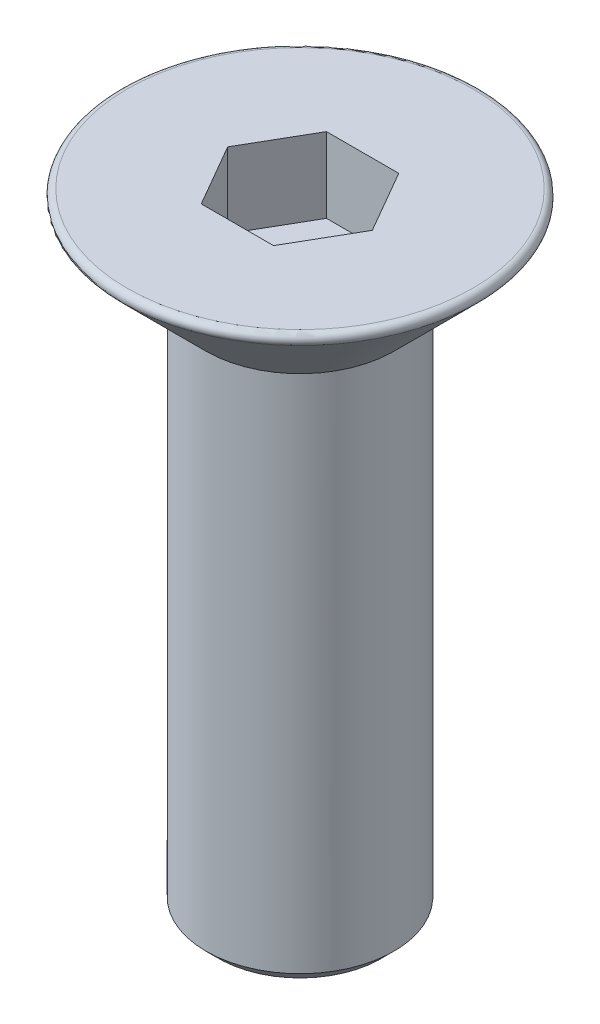
ISO-10303-21;
HEADER;
FILE_DESCRIPTION(('STEP AP214'),'2;1');
FILE_NAME('part.step','',(''),(''),'','','');
FILE_SCHEMA(('AUTOMOTIVE_DESIGN { 1 0 10303 214 1 1 1 1 }'));
ENDSEC;
DATA;
#1=APPLICATION_CONTEXT('core data for automotive mechanical design processes');
#2=APPLICATION_PROTOCOL_DEFINITION('international standard','automotive_design',2000,#1);
#3=PRODUCT_CONTEXT('',#1,'mechanical');
#4=PRODUCT('Part','Part','',(#3));
#5=PRODUCT_RELATED_PRODUCT_CATEGORY('part','',(#4));
#6=PRODUCT_DEFINITION_FORMATION('','',#4);
#7=PRODUCT_DEFINITION_CONTEXT('part definition',#1,'design');
#8=PRODUCT_DEFINITION('design','',#6,#7);
#9=PRODUCT_DEFINITION_SHAPE('','',#8);
#10=(LENGTH_UNIT() NAMED_UNIT(*) SI_UNIT(.MILLI.,.METRE.));
#11=(NAMED_UNIT(*) PLANE_ANGLE_UNIT() SI_UNIT($,.RADIAN.));
#12=(NAMED_UNIT(*) SI_UNIT($,.STERADIAN.) SOLID_ANGLE_UNIT());
#13=UNCERTAINTY_MEASURE_WITH_UNIT(LENGTH_MEASURE(1.E-05),#10,'distance_accuracy_value','');
#14=(GEOMETRIC_REPRESENTATION_CONTEXT(3) GLOBAL_UNCERTAINTY_ASSIGNED_CONTEXT((#13)) GLOBAL_UNIT_ASSIGNED_CONTEXT((#10,
#11,#12)) REPRESENTATION_CONTEXT('',''));
#15=CARTESIAN_POINT('',(0.,0.,0.));
#16=DIRECTION('',(0.,0.,1.));
#17=DIRECTION('',(1.,0.,0.));
#18=AXIS2_PLACEMENT_3D('',#15,#16,#17);
#19=CARTESIAN_POINT('',(0.,0.,0.));
#20=DIRECTION('',(0.,-1.,0.));
#21=DIRECTION('',(0.,0.,-1.));
#22=AXIS2_PLACEMENT_3D('',#19,#20,#21);
#23=PLANE('',#22);
#24=CARTESIAN_POINT('',(0.,0.,0.));
#25=DIRECTION('',(0.,-1.,0.));
#26=DIRECTION('',(0.,0.,-1.));
#27=AXIS2_PLACEMENT_3D('',#24,#25,#26);
#28=CIRCLE('',#27,1.3);
#29=CARTESIAN_POINT('',(0.,0.,-1.3));
#30=VERTEX_POINT('',#29);
#31=EDGE_CURVE('E11',#30,#30,#28,.T.);
#32=ORIENTED_EDGE('',*,*,#31,.T.);
#33=EDGE_LOOP('',(#32));
#34=FACE_BOUND('',#33,.T.);
#35=ADVANCED_FACE('F17',(#34),#23,.T.);
#36=CARTESIAN_POINT('',(0.,50.9004739336492,0.));
#37=DIRECTION('',(0.,1.,0.));
#38=DIRECTION('',(0.,0.,1.));
#39=AXIS2_PLACEMENT_3D('',#36,#37,#38);
#40=CYLINDRICAL_SURFACE('',#39,1.5);
#41=CARTESIAN_POINT('',(0.,0.2,0.));
#42=DIRECTION('',(0.,-1.,0.));
#43=DIRECTION('',(0.,0.,-1.));
#44=AXIS2_PLACEMENT_3D('',#41,#42,#43);
#45=CIRCLE('',#44,1.5);
#46=CARTESIAN_POINT('',(0.,0.2,-1.5));
#47=VERTEX_POINT('',#46);
#48=EDGE_CURVE('E25',#47,#47,#45,.F.);
#49=ORIENTED_EDGE('',*,*,#48,.T.);
#50=EDGE_LOOP('',(#49));
#51=FACE_BOUND('',#50,.T.);
#52=CARTESIAN_POINT('',(0.,8.5,0.));
#53=DIRECTION('',(0.,1.,0.));
#54=DIRECTION('',(0.,0.,1.));
#55=AXIS2_PLACEMENT_3D('',#52,#53,#54);
#56=CIRCLE('',#55,1.5);
#57=CARTESIAN_POINT('',(0.,8.5,1.5));
#58=VERTEX_POINT('',#57);
#59=EDGE_CURVE('E119',#58,#58,#56,.T.);
#60=ORIENTED_EDGE('',*,*,#59,.F.);
#61=EDGE_LOOP('',(#60));
#62=FACE_BOUND('',#61,.T.);
#63=ADVANCED_FACE('F135',(#51,#62),#40,.T.);
#64=CARTESIAN_POINT('',(0.,10.,0.));
#65=DIRECTION('',(0.,1.,0.));
#66=DIRECTION('',(0.,0.,1.));
#67=AXIS2_PLACEMENT_3D('',#64,#65,#66);
#68=CONICAL_SURFACE('',#67,3.,0.78539816339745);
#69=CARTESIAN_POINT('',(0.,9.82928932188135,0.));
#70=DIRECTION('',(0.,-1.,0.));
#71=DIRECTION('',(0.,0.,-1.));
#72=AXIS2_PLACEMENT_3D('',#69,#70,#71);
#73=CIRCLE('',#72,2.82928932188134);
#74=CARTESIAN_POINT('',(0.,9.82928932188135,-2.82928932188134));
#75=VERTEX_POINT('',#74);
#76=EDGE_CURVE('E130',#75,#75,#73,.T.);
#77=ORIENTED_EDGE('',*,*,#76,.T.);
#78=EDGE_LOOP('',(#77));
#79=FACE_BOUND('',#78,.T.);
#80=ORIENTED_EDGE('',*,*,#59,.T.);
#81=EDGE_LOOP('',(#80));
#82=FACE_BOUND('',#81,.T.);
#83=ADVANCED_FACE('F160',(#79,#82),#68,.T.);
#84=CARTESIAN_POINT('',(-3.,10.,0.));
#85=DIRECTION('',(0.,1.,0.));
#86=DIRECTION('',(0.,0.,1.));
#87=AXIS2_PLACEMENT_3D('',#84,#85,#86);
#88=PLANE('',#87);
#89=DIRECTION('',(0.5,0.,-0.866025403784439));
#90=VECTOR('',#89,1.);
#91=CARTESIAN_POINT('',(0.577350269189626,10.,1.));
#92=LINE('',#91,#90);
#93=CARTESIAN_POINT('',(0.577350269189626,10.,1.));
#94=VERTEX_POINT('',#93);
#95=CARTESIAN_POINT('',(1.15470053837925,10.,0.));
#96=VERTEX_POINT('',#95);
#97=EDGE_CURVE('E32',#94,#96,#92,.T.);
#98=ORIENTED_EDGE('',*,*,#97,.F.);
#99=DIRECTION('',(1.,0.,0.));
#100=VECTOR('',#99,1.);
#101=CARTESIAN_POINT('',(-0.577350269189626,10.,1.));
#102=LINE('',#101,#100);
#103=CARTESIAN_POINT('',(-0.577350269189626,10.,1.));
#104=VERTEX_POINT('',#103);
#105=EDGE_CURVE('E115',#104,#94,#102,.T.);
#106=ORIENTED_EDGE('',*,*,#105,.F.);
#107=DIRECTION('',(0.5,0.,0.866025403784439));
#108=VECTOR('',#107,1.);
#109=CARTESIAN_POINT('',(-1.15470053837925,10.,0.));
#110=LINE('',#109,#108);
#111=CARTESIAN_POINT('',(-1.15470053837925,10.,0.));
#112=VERTEX_POINT('',#111);
#113=EDGE_CURVE('E113',#112,#104,#110,.T.);
#114=ORIENTED_EDGE('',*,*,#113,.F.);
#115=DIRECTION('',(-0.5,0.,0.866025403784439));
#116=VECTOR('',#115,1.);
#117=CARTESIAN_POINT('',(-0.577350269189626,10.,-1.));
#118=LINE('',#117,#116);
#119=CARTESIAN_POINT('',(-0.577350269189626,10.,-1.));
#120=VERTEX_POINT('',#119);
#121=EDGE_CURVE('E80',#120,#112,#118,.T.);
#122=ORIENTED_EDGE('',*,*,#121,.F.);
#123=DIRECTION('',(-1.,0.,0.));
#124=VECTOR('',#123,1.);
#125=CARTESIAN_POINT('',(0.577350269189626,10.,-1.));
#126=LINE('',#125,#124);
#127=CARTESIAN_POINT('',(0.577350269189626,10.,-1.));
#128=VERTEX_POINT('',#127);
#129=EDGE_CURVE('E109',#128,#120,#126,.T.);
#130=ORIENTED_EDGE('',*,*,#129,.F.);
#131=DIRECTION('',(-0.5,0.,-0.866025403784439));
#132=VECTOR('',#131,1.);
#133=CARTESIAN_POINT('',(1.15470053837925,10.,0.));
#134=LINE('',#133,#132);
#135=EDGE_CURVE('E106',#96,#128,#134,.T.);
#136=ORIENTED_EDGE('',*,*,#135,.F.);
#137=EDGE_LOOP('',(#98,#106,#114,#122,#130,#136));
#138=FACE_BOUND('',#137,.T.);
#139=CARTESIAN_POINT('',(0.,10.,0.));
#140=DIRECTION('',(0.,1.,0.));
#141=DIRECTION('',(0.,0.,1.));
#142=AXIS2_PLACEMENT_3D('',#139,#140,#141);
#143=CIRCLE('',#142,2.75857864376268);
#144=CARTESIAN_POINT('',(0.,10.,2.75857864376268));
#145=VERTEX_POINT('',#144);
#146=EDGE_CURVE('E127',#145,#145,#143,.T.);
#147=ORIENTED_EDGE('',*,*,#146,.T.);
#148=EDGE_LOOP('',(#147));
#149=FACE_BOUND('',#148,.T.);
#150=ADVANCED_FACE('F150',(#138,#149),#88,.T.);
#151=CARTESIAN_POINT('',(0.,9.9,0.));
#152=DIRECTION('',(0.,1.,0.));
#153=DIRECTION('',(0.,0.,1.));
#154=AXIS2_PLACEMENT_3D('',#151,#152,#153);
#155=TOROIDAL_SURFACE('',#154,2.75857864376268,0.1);
#156=ORIENTED_EDGE('',*,*,#76,.F.);
#157=EDGE_LOOP('',(#156));
#158=FACE_BOUND('',#157,.T.);
#159=ORIENTED_EDGE('',*,*,#146,.F.);
#160=EDGE_LOOP('',(#159));
#161=FACE_BOUND('',#160,.T.);
#162=ADVANCED_FACE('F140',(#158,#161),#155,.T.);
#163=CARTESIAN_POINT('',(0.,0.2,0.));
#164=DIRECTION('',(0.,1.,0.));
#165=DIRECTION('',(0.,0.,1.));
#166=AXIS2_PLACEMENT_3D('',#163,#164,#165);
#167=CONICAL_SURFACE('',#166,1.5,0.785398163397448);
#168=ORIENTED_EDGE('',*,*,#31,.F.);
#169=EDGE_LOOP('',(#168));
#170=FACE_BOUND('',#169,.T.);
#171=ORIENTED_EDGE('',*,*,#48,.F.);
#172=EDGE_LOOP('',(#171));
#173=FACE_BOUND('',#172,.T.);
#174=ADVANCED_FACE('F19',(#170,#173),#167,.T.);
#175=CARTESIAN_POINT('',(0.577350269189626,8.8,1.));
#176=DIRECTION('',(0.866025403784439,0.,0.5));
#177=DIRECTION('',(0.5,0.,-0.866025403784439));
#178=AXIS2_PLACEMENT_3D('',#175,#176,#177);
#179=PLANE('',#178);
#180=ORIENTED_EDGE('',*,*,#97,.T.);
#181=DIRECTION('',(0.,1.,0.));
#182=VECTOR('',#181,1.);
#183=CARTESIAN_POINT('',(1.15470053837925,8.8,0.));
#184=LINE('',#183,#182);
#185=CARTESIAN_POINT('',(1.15470053837925,8.8,0.));
#186=VERTEX_POINT('',#185);
#187=EDGE_CURVE('E62',#186,#96,#184,.T.);
#188=ORIENTED_EDGE('',*,*,#187,.F.);
#189=DIRECTION('',(0.5,0.,-0.866025403784439));
#190=VECTOR('',#189,1.);
#191=CARTESIAN_POINT('',(0.577350269189626,8.8,1.));
#192=LINE('',#191,#190);
#193=CARTESIAN_POINT('',(0.577350269189626,8.8,1.));
#194=VERTEX_POINT('',#193);
#195=EDGE_CURVE('E117',#194,#186,#192,.T.);
#196=ORIENTED_EDGE('',*,*,#195,.F.);
#197=DIRECTION('',(0.,1.,0.));
#198=VECTOR('',#197,1.);
#199=CARTESIAN_POINT('',(0.577350269189626,8.8,1.));
#200=LINE('',#199,#198);
#201=EDGE_CURVE('E40',#194,#94,#200,.T.);
#202=ORIENTED_EDGE('',*,*,#201,.T.);
#203=EDGE_LOOP('',(#180,#188,#196,#202));
#204=FACE_BOUND('',#203,.T.);
#205=ADVANCED_FACE('F139',(#204),#179,.F.);
#206=CARTESIAN_POINT('',(-0.577350269189626,8.8,1.));
#207=DIRECTION('',(0.,0.,1.));
#208=DIRECTION('',(1.,0.,0.));
#209=AXIS2_PLACEMENT_3D('',#206,#207,#208);
#210=PLANE('',#209);
#211=ORIENTED_EDGE('',*,*,#105,.T.);
#212=ORIENTED_EDGE('',*,*,#201,.F.);
#213=DIRECTION('',(1.,0.,0.));
#214=VECTOR('',#213,1.);
#215=CARTESIAN_POINT('',(-0.577350269189626,8.8,1.));
#216=LINE('',#215,#214);
#217=CARTESIAN_POINT('',(-0.577350269189626,8.8,1.));
#218=VERTEX_POINT('',#217);
#219=EDGE_CURVE('E92',#218,#194,#216,.T.);
#220=ORIENTED_EDGE('',*,*,#219,.F.);
#221=DIRECTION('',(0.,1.,0.));
#222=VECTOR('',#221,1.);
#223=CARTESIAN_POINT('',(-0.577350269189626,8.8,1.));
#224=LINE('',#223,#222);
#225=EDGE_CURVE('E84',#218,#104,#224,.T.);
#226=ORIENTED_EDGE('',*,*,#225,.T.);
#227=EDGE_LOOP('',(#211,#212,#220,#226));
#228=FACE_BOUND('',#227,.T.);
#229=ADVANCED_FACE('F148',(#228),#210,.F.);
#230=CARTESIAN_POINT('',(-1.15470053837925,8.8,0.));
#231=DIRECTION('',(-0.866025403784439,0.,0.5));
#232=DIRECTION('',(0.5,0.,0.866025403784439));
#233=AXIS2_PLACEMENT_3D('',#230,#231,#232);
#234=PLANE('',#233);
#235=ORIENTED_EDGE('',*,*,#113,.T.);
#236=ORIENTED_EDGE('',*,*,#225,.F.);
#237=DIRECTION('',(0.5,0.,0.866025403784439));
#238=VECTOR('',#237,1.);
#239=CARTESIAN_POINT('',(-1.15470053837925,8.8,0.));
#240=LINE('',#239,#238);
#241=CARTESIAN_POINT('',(-1.15470053837925,8.8,0.));
#242=VERTEX_POINT('',#241);
#243=EDGE_CURVE('E88',#242,#218,#240,.T.);
#244=ORIENTED_EDGE('',*,*,#243,.F.);
#245=DIRECTION('',(0.,1.,0.));
#246=VECTOR('',#245,1.);
#247=CARTESIAN_POINT('',(-1.15470053837925,8.8,0.));
#248=LINE('',#247,#246);
#249=EDGE_CURVE('E73',#242,#112,#248,.T.);
#250=ORIENTED_EDGE('',*,*,#249,.T.);
#251=EDGE_LOOP('',(#235,#236,#244,#250));
#252=FACE_BOUND('',#251,.T.);
#253=ADVANCED_FACE('F89',(#252),#234,.F.);
#254=CARTESIAN_POINT('',(-0.577350269189626,8.8,-1.));
#255=DIRECTION('',(-0.866025403784439,0.,-0.5));
#256=DIRECTION('',(-0.5,0.,0.866025403784439));
#257=AXIS2_PLACEMENT_3D('',#254,#255,#256);
#258=PLANE('',#257);
#259=ORIENTED_EDGE('',*,*,#121,.T.);
#260=ORIENTED_EDGE('',*,*,#249,.F.);
#261=DIRECTION('',(-0.5,0.,0.866025403784439));
#262=VECTOR('',#261,1.);
#263=CARTESIAN_POINT('',(-0.577350269189626,8.8,-1.));
#264=LINE('',#263,#262);
#265=CARTESIAN_POINT('',(-0.577350269189626,8.8,-1.));
#266=VERTEX_POINT('',#265);
#267=EDGE_CURVE('E77',#266,#242,#264,.T.);
#268=ORIENTED_EDGE('',*,*,#267,.F.);
#269=DIRECTION('',(0.,1.,0.));
#270=VECTOR('',#269,1.);
#271=CARTESIAN_POINT('',(-0.577350269189626,8.8,-1.));
#272=LINE('',#271,#270);
#273=EDGE_CURVE('E85',#266,#120,#272,.T.);
#274=ORIENTED_EDGE('',*,*,#273,.T.);
#275=EDGE_LOOP('',(#259,#260,#268,#274));
#276=FACE_BOUND('',#275,.T.);
#277=ADVANCED_FACE('F75',(#276),#258,.F.);
#278=CARTESIAN_POINT('',(0.577350269189626,8.8,-1.));
#279=DIRECTION('',(0.,0.,-1.));
#280=DIRECTION('',(-1.,0.,0.));
#281=AXIS2_PLACEMENT_3D('',#278,#279,#280);
#282=PLANE('',#281);
#283=ORIENTED_EDGE('',*,*,#129,.T.);
#284=ORIENTED_EDGE('',*,*,#273,.F.);
#285=DIRECTION('',(-1.,0.,0.));
#286=VECTOR('',#285,1.);
#287=CARTESIAN_POINT('',(0.577350269189626,8.8,-1.));
#288=LINE('',#287,#286);
#289=CARTESIAN_POINT('',(0.577350269189626,8.8,-1.));
#290=VERTEX_POINT('',#289);
#291=EDGE_CURVE('E98',#290,#266,#288,.T.);
#292=ORIENTED_EDGE('',*,*,#291,.F.);
#293=DIRECTION('',(0.,1.,0.));
#294=VECTOR('',#293,1.);
#295=CARTESIAN_POINT('',(0.577350269189626,8.8,-1.));
#296=LINE('',#295,#294);
#297=EDGE_CURVE('E122',#290,#128,#296,.T.);
#298=ORIENTED_EDGE('',*,*,#297,.T.);
#299=EDGE_LOOP('',(#283,#284,#292,#298));
#300=FACE_BOUND('',#299,.T.);
#301=ADVANCED_FACE('F172',(#300),#282,.F.);
#302=CARTESIAN_POINT('',(1.15470053837925,8.8,0.));
#303=DIRECTION('',(0.866025403784439,0.,-0.5));
#304=DIRECTION('',(-0.5,0.,-0.866025403784439));
#305=AXIS2_PLACEMENT_3D('',#302,#303,#304);
#306=PLANE('',#305);
#307=ORIENTED_EDGE('',*,*,#135,.T.);
#308=ORIENTED_EDGE('',*,*,#297,.F.);
#309=DIRECTION('',(-0.5,0.,-0.866025403784439));
#310=VECTOR('',#309,1.);
#311=CARTESIAN_POINT('',(1.15470053837925,8.8,0.));
#312=LINE('',#311,#310);
#313=EDGE_CURVE('E100',#186,#290,#312,.T.);
#314=ORIENTED_EDGE('',*,*,#313,.F.);
#315=ORIENTED_EDGE('',*,*,#187,.T.);
#316=EDGE_LOOP('',(#307,#308,#314,#315));
#317=FACE_BOUND('',#316,.T.);
#318=ADVANCED_FACE('F169',(#317),#306,.F.);
#319=CARTESIAN_POINT('',(0.,8.8,0.));
#320=DIRECTION('',(0.,1.,0.));
#321=DIRECTION('',(0.,0.,1.));
#322=AXIS2_PLACEMENT_3D('',#319,#320,#321);
#323=PLANE('',#322);
#324=ORIENTED_EDGE('',*,*,#195,.T.);
#325=ORIENTED_EDGE('',*,*,#313,.T.);
#326=ORIENTED_EDGE('',*,*,#291,.T.);
#327=ORIENTED_EDGE('',*,*,#267,.T.);
#328=ORIENTED_EDGE('',*,*,#243,.T.);
#329=ORIENTED_EDGE('',*,*,#219,.T.);
#330=EDGE_LOOP('',(#324,#325,#326,#327,#328,#329));
#331=FACE_BOUND('',#330,.T.);
#332=ADVANCED_FACE('F95',(#331),#323,.T.);
#333=CLOSED_SHELL('',(#35,#63,#83,#150,#162,#174,#205,#229,#253,#277,#301,#318,#332));
#334=MANIFOLD_SOLID_BREP('B1',#333);
#335=ADVANCED_BREP_SHAPE_REPRESENTATION('',(#18,#334),#14);
#336=SHAPE_DEFINITION_REPRESENTATION(#9,#335);
ENDSEC;
END-ISO-10303-21;
